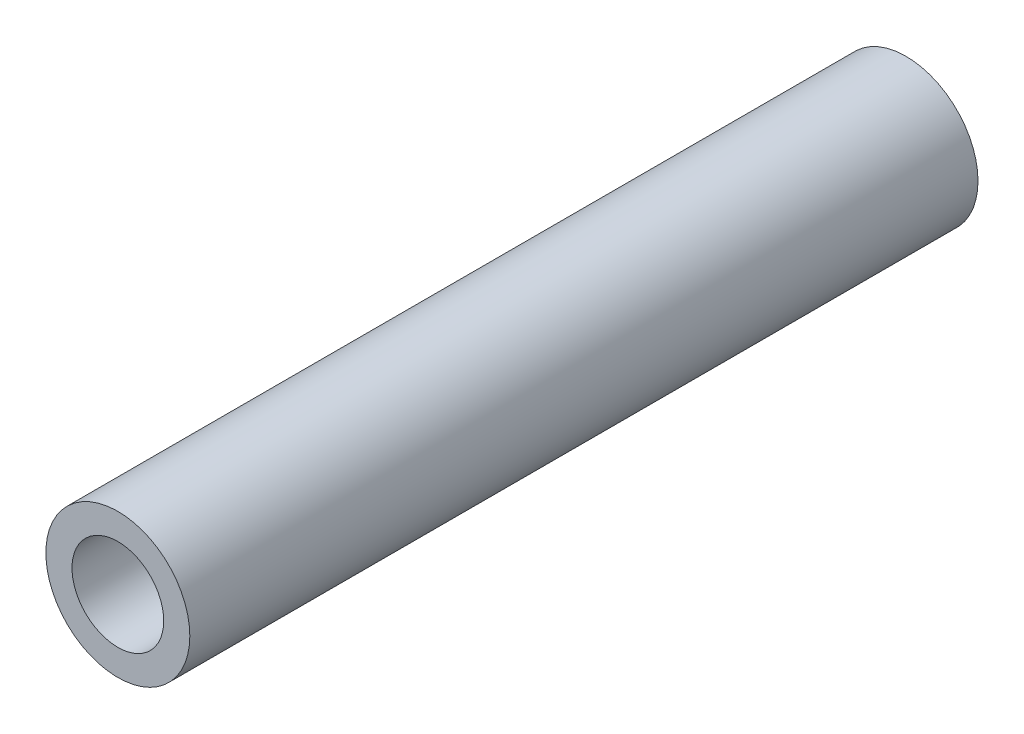
ISO-10303-21;
HEADER;
FILE_DESCRIPTION(('STEP AP214'),'2;1');
FILE_NAME('part.step','',(''),(''),'','','');
FILE_SCHEMA(('AUTOMOTIVE_DESIGN { 1 0 10303 214 1 1 1 1 }'));
ENDSEC;
DATA;
#1=APPLICATION_CONTEXT('core data for automotive mechanical design processes');
#2=APPLICATION_PROTOCOL_DEFINITION('international standard','automotive_design',2000,#1);
#3=PRODUCT_CONTEXT('',#1,'mechanical');
#4=PRODUCT('Part','Part','',(#3));
#5=PRODUCT_RELATED_PRODUCT_CATEGORY('part','',(#4));
#6=PRODUCT_DEFINITION_FORMATION('','',#4);
#7=PRODUCT_DEFINITION_CONTEXT('part definition',#1,'design');
#8=PRODUCT_DEFINITION('design','',#6,#7);
#9=PRODUCT_DEFINITION_SHAPE('','',#8);
#10=(LENGTH_UNIT() NAMED_UNIT(*) SI_UNIT(.MILLI.,.METRE.));
#11=(NAMED_UNIT(*) PLANE_ANGLE_UNIT() SI_UNIT($,.RADIAN.));
#12=(NAMED_UNIT(*) SI_UNIT($,.STERADIAN.) SOLID_ANGLE_UNIT());
#13=UNCERTAINTY_MEASURE_WITH_UNIT(LENGTH_MEASURE(1.E-05),#10,'distance_accuracy_value','');
#14=(GEOMETRIC_REPRESENTATION_CONTEXT(3) GLOBAL_UNCERTAINTY_ASSIGNED_CONTEXT((#13)) GLOBAL_UNIT_ASSIGNED_CONTEXT((#10,
#11,#12)) REPRESENTATION_CONTEXT('',''));
#15=CARTESIAN_POINT('',(0.,0.,0.));
#16=DIRECTION('',(0.,0.,1.));
#17=DIRECTION('',(1.,0.,0.));
#18=AXIS2_PLACEMENT_3D('',#15,#16,#17);
#19=CARTESIAN_POINT('',(0.,0.,29.564941752572));
#20=DIRECTION('',(0.,0.,1.));
#21=DIRECTION('',(1.,0.,0.));
#22=AXIS2_PLACEMENT_3D('',#19,#20,#21);
#23=PLANE('',#22);
#24=CARTESIAN_POINT('',(0.,0.,29.564941752572));
#25=DIRECTION('',(0.,0.,1.));
#26=DIRECTION('',(1.,0.,0.));
#27=AXIS2_PLACEMENT_3D('',#24,#25,#26);
#28=CIRCLE('',#27,2.7);
#29=CARTESIAN_POINT('',(2.7,0.,29.564941752572));
#30=VERTEX_POINT('',#29);
#31=EDGE_CURVE('E10',#30,#30,#28,.T.);
#32=ORIENTED_EDGE('',*,*,#31,.T.);
#33=EDGE_LOOP('',(#32));
#34=FACE_BOUND('',#33,.T.);
#35=CARTESIAN_POINT('',(0.,0.,29.564941752572));
#36=DIRECTION('',(0.,0.,1.));
#37=DIRECTION('',(1.,0.,0.));
#38=AXIS2_PLACEMENT_3D('',#35,#36,#37);
#39=CIRCLE('',#38,1.72);
#40=CARTESIAN_POINT('',(1.72,0.,29.564941752572));
#41=VERTEX_POINT('',#40);
#42=EDGE_CURVE('E48',#41,#41,#39,.T.);
#43=ORIENTED_EDGE('',*,*,#42,.F.);
#44=EDGE_LOOP('',(#43));
#45=FACE_BOUND('',#44,.T.);
#46=ADVANCED_FACE('F40',(#34,#45),#23,.T.);
#47=CARTESIAN_POINT('',(0.,0.,0.));
#48=DIRECTION('',(0.,0.,1.));
#49=DIRECTION('',(1.,0.,0.));
#50=AXIS2_PLACEMENT_3D('',#47,#48,#49);
#51=PLANE('',#50);
#52=CARTESIAN_POINT('',(0.,0.,0.));
#53=DIRECTION('',(0.,0.,1.));
#54=DIRECTION('',(1.,0.,0.));
#55=AXIS2_PLACEMENT_3D('',#52,#53,#54);
#56=CIRCLE('',#55,2.7);
#57=CARTESIAN_POINT('',(2.7,0.,0.));
#58=VERTEX_POINT('',#57);
#59=EDGE_CURVE('E41',#58,#58,#56,.T.);
#60=ORIENTED_EDGE('',*,*,#59,.F.);
#61=EDGE_LOOP('',(#60));
#62=FACE_BOUND('',#61,.T.);
#63=CARTESIAN_POINT('',(0.,0.,0.));
#64=DIRECTION('',(0.,0.,1.));
#65=DIRECTION('',(1.,0.,0.));
#66=AXIS2_PLACEMENT_3D('',#63,#64,#65);
#67=CIRCLE('',#66,1.72);
#68=CARTESIAN_POINT('',(1.72,0.,0.));
#69=VERTEX_POINT('',#68);
#70=EDGE_CURVE('E49',#69,#69,#67,.T.);
#71=ORIENTED_EDGE('',*,*,#70,.T.);
#72=EDGE_LOOP('',(#71));
#73=FACE_BOUND('',#72,.T.);
#74=ADVANCED_FACE('F58',(#62,#73),#51,.F.);
#75=CARTESIAN_POINT('',(0.,0.,29.564941752572));
#76=DIRECTION('',(0.,0.,-1.));
#77=DIRECTION('',(-1.,0.,0.));
#78=AXIS2_PLACEMENT_3D('',#75,#76,#77);
#79=CYLINDRICAL_SURFACE('',#78,2.7);
#80=ORIENTED_EDGE('',*,*,#31,.F.);
#81=EDGE_LOOP('',(#80));
#82=FACE_BOUND('',#81,.T.);
#83=ORIENTED_EDGE('',*,*,#59,.T.);
#84=EDGE_LOOP('',(#83));
#85=FACE_BOUND('',#84,.T.);
#86=ADVANCED_FACE('F39',(#82,#85),#79,.T.);
#87=CARTESIAN_POINT('',(0.,0.,29.564941752572));
#88=DIRECTION('',(0.,0.,-1.));
#89=DIRECTION('',(-1.,0.,0.));
#90=AXIS2_PLACEMENT_3D('',#87,#88,#89);
#91=CYLINDRICAL_SURFACE('',#90,1.72);
#92=ORIENTED_EDGE('',*,*,#42,.T.);
#93=EDGE_LOOP('',(#92));
#94=FACE_BOUND('',#93,.T.);
#95=ORIENTED_EDGE('',*,*,#70,.F.);
#96=EDGE_LOOP('',(#95));
#97=FACE_BOUND('',#96,.T.);
#98=ADVANCED_FACE('F57',(#94,#97),#91,.F.);
#99=CLOSED_SHELL('',(#46,#74,#86,#98));
#100=MANIFOLD_SOLID_BREP('B2',#99);
#101=ADVANCED_BREP_SHAPE_REPRESENTATION('',(#18,#100),#14);
#102=SHAPE_DEFINITION_REPRESENTATION(#9,#101);
ENDSEC;
END-ISO-10303-21;
